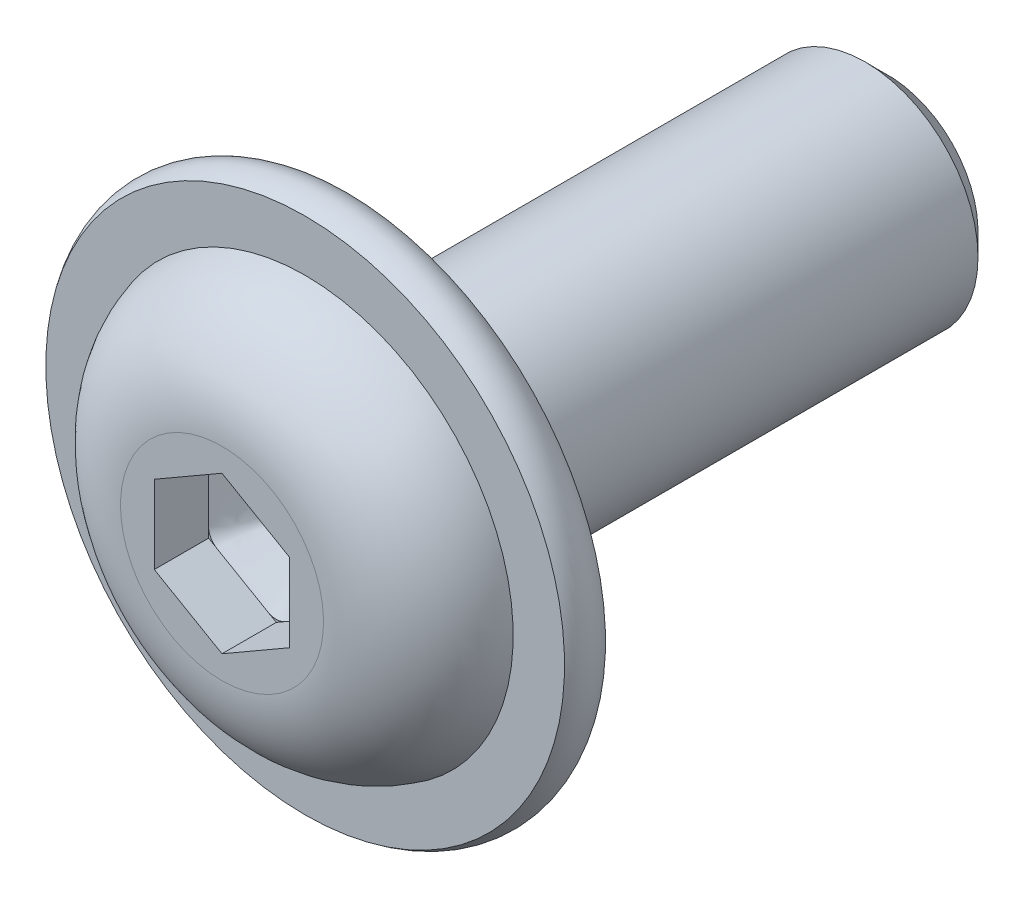
ISO-10303-21;
HEADER;
FILE_DESCRIPTION(('STEP AP214'),'2;1');
FILE_NAME('part.step','',(''),(''),'','','');
FILE_SCHEMA(('AUTOMOTIVE_DESIGN { 1 0 10303 214 1 1 1 1 }'));
ENDSEC;
DATA;
#1=APPLICATION_CONTEXT('core data for automotive mechanical design processes');
#2=APPLICATION_PROTOCOL_DEFINITION('international standard','automotive_design',2000,#1);
#3=PRODUCT_CONTEXT('',#1,'mechanical');
#4=PRODUCT('Part','Part','',(#3));
#5=PRODUCT_RELATED_PRODUCT_CATEGORY('part','',(#4));
#6=PRODUCT_DEFINITION_FORMATION('','',#4);
#7=PRODUCT_DEFINITION_CONTEXT('part definition',#1,'design');
#8=PRODUCT_DEFINITION('design','',#6,#7);
#9=PRODUCT_DEFINITION_SHAPE('','',#8);
#10=(LENGTH_UNIT() NAMED_UNIT(*) SI_UNIT(.MILLI.,.METRE.));
#11=(NAMED_UNIT(*) PLANE_ANGLE_UNIT() SI_UNIT($,.RADIAN.));
#12=(NAMED_UNIT(*) SI_UNIT($,.STERADIAN.) SOLID_ANGLE_UNIT());
#13=UNCERTAINTY_MEASURE_WITH_UNIT(LENGTH_MEASURE(1.E-05),#10,'distance_accuracy_value','');
#14=(GEOMETRIC_REPRESENTATION_CONTEXT(3) GLOBAL_UNCERTAINTY_ASSIGNED_CONTEXT((#13)) GLOBAL_UNIT_ASSIGNED_CONTEXT((#10,
#11,#12)) REPRESENTATION_CONTEXT('',''));
#15=CARTESIAN_POINT('',(0.,0.,0.));
#16=DIRECTION('',(0.,0.,1.));
#17=DIRECTION('',(1.,0.,0.));
#18=AXIS2_PLACEMENT_3D('',#15,#16,#17);
#19=CARTESIAN_POINT('',(0.,0.,6.171875));
#20=DIRECTION('',(0.,0.,1.));
#21=DIRECTION('',(1.,0.,0.));
#22=AXIS2_PLACEMENT_3D('',#19,#20,#21);
#23=PLANE('',#22);
#24=CARTESIAN_POINT('',(-1.125,0.649519052838322,6.171875));
#25=DIRECTION('',(0.,0.,1.));
#26=DIRECTION('',(1.,0.,0.));
#27=AXIS2_PLACEMENT_3D('',#24,#25,#26);
#28=CIRCLE('',#27,0.375);
#29=CARTESIAN_POINT('',(-1.3125,0.974278579257486,6.171875));
#30=VERTEX_POINT('',#29);
#31=CARTESIAN_POINT('',(-1.5,0.649519052850495,6.171875));
#32=VERTEX_POINT('',#31);
#33=EDGE_CURVE('E522',#30,#32,#28,.T.);
#34=ORIENTED_EDGE('',*,*,#33,.F.);
#35=DIRECTION('',(-0.866025403784438,-0.5,0.));
#36=VECTOR('',#35,1.);
#37=CARTESIAN_POINT('',(0.,1.73205080756888,6.171875));
#38=LINE('',#37,#36);
#39=CARTESIAN_POINT('',(-1.5,0.866025403784436,6.171875));
#40=VERTEX_POINT('',#39);
#41=EDGE_CURVE('E375',#30,#40,#38,.T.);
#42=ORIENTED_EDGE('',*,*,#41,.T.);
#43=DIRECTION('',(0.,-1.,0.));
#44=VECTOR('',#43,1.);
#45=CARTESIAN_POINT('',(-1.5,0.866025403784436,6.171875));
#46=LINE('',#45,#44);
#47=EDGE_CURVE('E384',#40,#32,#46,.T.);
#48=ORIENTED_EDGE('',*,*,#47,.T.);
#49=EDGE_LOOP('',(#34,#42,#48));
#50=FACE_BOUND('',#49,.T.);
#51=ADVANCED_FACE('F265',(#50),#23,.T.);
#52=CARTESIAN_POINT('',(-1.125,-0.649519052838331,6.171875));
#53=DIRECTION('',(0.,0.,1.));
#54=DIRECTION('',(-1.,0.,0.));
#55=AXIS2_PLACEMENT_3D('',#52,#53,#54);
#56=CIRCLE('',#55,0.375);
#57=CARTESIAN_POINT('',(-1.5,-0.649519052880153,6.171875));
#58=VERTEX_POINT('',#57);
#59=CARTESIAN_POINT('',(-1.31249999999974,-0.974278579257641,6.171875));
#60=VERTEX_POINT('',#59);
#61=EDGE_CURVE('E513',#58,#60,#56,.T.);
#62=ORIENTED_EDGE('',*,*,#61,.F.);
#63=CARTESIAN_POINT('',(-1.5,-0.866025403784446,6.171875));
#64=VERTEX_POINT('',#63);
#65=EDGE_CURVE('E382',#58,#64,#46,.T.);
#66=ORIENTED_EDGE('',*,*,#65,.T.);
#67=DIRECTION('',(0.866025403784439,-0.5,0.));
#68=VECTOR('',#67,1.);
#69=CARTESIAN_POINT('',(-1.5,-0.866025403784446,6.171875));
#70=LINE('',#69,#68);
#71=EDGE_CURVE('E407',#64,#60,#70,.T.);
#72=ORIENTED_EDGE('',*,*,#71,.T.);
#73=EDGE_LOOP('',(#62,#66,#72));
#74=FACE_BOUND('',#73,.T.);
#75=ADVANCED_FACE('F706',(#74),#23,.T.);
#76=CARTESIAN_POINT('',(0.,-1.29903810567666,6.171875));
#77=DIRECTION('',(0.,0.,1.));
#78=DIRECTION('',(1.,0.,0.));
#79=AXIS2_PLACEMENT_3D('',#76,#77,#78);
#80=CIRCLE('',#79,0.375);
#81=CARTESIAN_POINT('',(-0.187500000016714,-1.62379763208617,6.171875));
#82=VERTEX_POINT('',#81);
#83=CARTESIAN_POINT('',(0.187500000030888,-1.62379763207799,6.171875));
#84=VERTEX_POINT('',#83);
#85=EDGE_CURVE('E587',#82,#84,#80,.T.);
#86=ORIENTED_EDGE('',*,*,#85,.F.);
#87=CARTESIAN_POINT('',(0.,-1.73205080756889,6.171875));
#88=VERTEX_POINT('',#87);
#89=EDGE_CURVE('E404',#82,#88,#70,.T.);
#90=ORIENTED_EDGE('',*,*,#89,.T.);
#91=DIRECTION('',(0.866025403784439,0.5,0.));
#92=VECTOR('',#91,1.);
#93=CARTESIAN_POINT('',(0.,-1.73205080756889,6.171875));
#94=LINE('',#93,#92);
#95=EDGE_CURVE('E417',#88,#84,#94,.T.);
#96=ORIENTED_EDGE('',*,*,#95,.T.);
#97=EDGE_LOOP('',(#86,#90,#96));
#98=FACE_BOUND('',#97,.T.);
#99=ADVANCED_FACE('F710',(#98),#23,.T.);
#100=CARTESIAN_POINT('',(1.125,-0.649519052838332,6.171875));
#101=DIRECTION('',(0.,0.,1.));
#102=DIRECTION('',(1.,0.,0.));
#103=AXIS2_PLACEMENT_3D('',#100,#101,#102);
#104=CIRCLE('',#103,0.375);
#105=CARTESIAN_POINT('',(1.31250000000463,-0.974278579254821,6.171875));
#106=VERTEX_POINT('',#105);
#107=CARTESIAN_POINT('',(1.5,-0.649519052850505,6.171875));
#108=VERTEX_POINT('',#107);
#109=EDGE_CURVE('E552',#106,#108,#104,.T.);
#110=ORIENTED_EDGE('',*,*,#109,.F.);
#111=CARTESIAN_POINT('',(1.5,-0.866025403784445,6.171875));
#112=VERTEX_POINT('',#111);
#113=EDGE_CURVE('E415',#106,#112,#94,.T.);
#114=ORIENTED_EDGE('',*,*,#113,.T.);
#115=DIRECTION('',(0.,1.,0.));
#116=VECTOR('',#115,1.);
#117=CARTESIAN_POINT('',(1.5,-0.866025403784445,6.171875));
#118=LINE('',#117,#116);
#119=EDGE_CURVE('E431',#112,#108,#118,.T.);
#120=ORIENTED_EDGE('',*,*,#119,.T.);
#121=EDGE_LOOP('',(#110,#114,#120));
#122=FACE_BOUND('',#121,.T.);
#123=ADVANCED_FACE('F714',(#122),#23,.T.);
#124=CARTESIAN_POINT('',(1.125,0.649519052838322,6.171875));
#125=DIRECTION('',(0.,0.,1.));
#126=DIRECTION('',(1.,0.,0.));
#127=AXIS2_PLACEMENT_3D('',#124,#125,#126);
#128=CIRCLE('',#127,0.375);
#129=CARTESIAN_POINT('',(1.5,0.649519052880143,6.171875));
#130=VERTEX_POINT('',#129);
#131=CARTESIAN_POINT('',(1.31249999999974,0.974278579257632,6.171875));
#132=VERTEX_POINT('',#131);
#133=EDGE_CURVE('E445',#130,#132,#128,.T.);
#134=ORIENTED_EDGE('',*,*,#133,.F.);
#135=CARTESIAN_POINT('',(1.5,0.866025403784436,6.171875));
#136=VERTEX_POINT('',#135);
#137=EDGE_CURVE('E419',#130,#136,#118,.T.);
#138=ORIENTED_EDGE('',*,*,#137,.T.);
#139=DIRECTION('',(-0.866025403784439,0.5,0.));
#140=VECTOR('',#139,1.);
#141=CARTESIAN_POINT('',(1.5,0.866025403784436,6.171875));
#142=LINE('',#141,#140);
#143=EDGE_CURVE('E436',#136,#132,#142,.T.);
#144=ORIENTED_EDGE('',*,*,#143,.T.);
#145=EDGE_LOOP('',(#134,#138,#144));
#146=FACE_BOUND('',#145,.T.);
#147=ADVANCED_FACE('F443',(#146),#23,.T.);
#148=CARTESIAN_POINT('',(0.,0.,7.375));
#149=DIRECTION('',(0.,0.,-1.));
#150=DIRECTION('',(0.,1.,0.));
#151=AXIS2_PLACEMENT_3D('',#148,#149,#150);
#152=PLANE('',#151);
#153=DIRECTION('',(0.,-1.,0.));
#154=VECTOR('',#153,1.);
#155=CARTESIAN_POINT('',(-1.5,0.866025403784436,7.375));
#156=LINE('',#155,#154);
#157=CARTESIAN_POINT('',(-1.5,0.866025403784436,7.375));
#158=VERTEX_POINT('',#157);
#159=CARTESIAN_POINT('',(-1.5,-0.866025403784446,7.375));
#160=VERTEX_POINT('',#159);
#161=EDGE_CURVE('E625',#158,#160,#156,.T.);
#162=ORIENTED_EDGE('',*,*,#161,.F.);
#163=DIRECTION('',(-0.866025403784438,-0.5,0.));
#164=VECTOR('',#163,1.);
#165=CARTESIAN_POINT('',(0.,1.73205080756888,7.375));
#166=LINE('',#165,#164);
#167=CARTESIAN_POINT('',(0.,1.73205080756888,7.375));
#168=VERTEX_POINT('',#167);
#169=EDGE_CURVE('E291',#168,#158,#166,.T.);
#170=ORIENTED_EDGE('',*,*,#169,.F.);
#171=DIRECTION('',(-0.866025403784439,0.5,0.));
#172=VECTOR('',#171,1.);
#173=CARTESIAN_POINT('',(1.5,0.866025403784436,7.375));
#174=LINE('',#173,#172);
#175=CARTESIAN_POINT('',(1.5,0.866025403784436,7.375));
#176=VERTEX_POINT('',#175);
#177=EDGE_CURVE('E386',#176,#168,#174,.T.);
#178=ORIENTED_EDGE('',*,*,#177,.F.);
#179=DIRECTION('',(0.,1.,0.));
#180=VECTOR('',#179,1.);
#181=CARTESIAN_POINT('',(1.5,-0.866025403784445,7.375));
#182=LINE('',#181,#180);
#183=CARTESIAN_POINT('',(1.5,-0.866025403784445,7.375));
#184=VERTEX_POINT('',#183);
#185=EDGE_CURVE('E453',#184,#176,#182,.T.);
#186=ORIENTED_EDGE('',*,*,#185,.F.);
#187=DIRECTION('',(0.866025403784439,0.5,0.));
#188=VECTOR('',#187,1.);
#189=CARTESIAN_POINT('',(0.,-1.73205080756889,7.375));
#190=LINE('',#189,#188);
#191=CARTESIAN_POINT('',(0.,-1.73205080756889,7.375));
#192=VERTEX_POINT('',#191);
#193=EDGE_CURVE('E632',#192,#184,#190,.T.);
#194=ORIENTED_EDGE('',*,*,#193,.F.);
#195=DIRECTION('',(0.866025403784439,-0.5,0.));
#196=VECTOR('',#195,1.);
#197=CARTESIAN_POINT('',(-1.5,-0.866025403784446,7.375));
#198=LINE('',#197,#196);
#199=EDGE_CURVE('E627',#160,#192,#198,.T.);
#200=ORIENTED_EDGE('',*,*,#199,.F.);
#201=EDGE_LOOP('',(#162,#170,#178,#186,#194,#200));
#202=FACE_BOUND('',#201,.T.);
#203=CARTESIAN_POINT('',(0.,0.,7.375));
#204=DIRECTION('',(0.,0.,1.));
#205=DIRECTION('',(0.,-1.,0.));
#206=AXIS2_PLACEMENT_3D('',#203,#204,#205);
#207=CIRCLE('',#206,2.25);
#208=CARTESIAN_POINT('',(0.,-2.25,7.375));
#209=VERTEX_POINT('',#208);
#210=EDGE_CURVE('E12',#209,#209,#207,.T.);
#211=ORIENTED_EDGE('',*,*,#210,.T.);
#212=EDGE_LOOP('',(#211));
#213=FACE_BOUND('',#212,.T.);
#214=ADVANCED_FACE('F267',(#202,#213),#152,.F.);
#215=CARTESIAN_POINT('',(0.,0.,4.94350347451832));
#216=DIRECTION('',(0.,0.,1.));
#217=DIRECTION('',(0.,-1.,0.));
#218=AXIS2_PLACEMENT_3D('',#215,#216,#217);
#219=DEGENERATE_TOROIDAL_SURFACE('',#218,2.25,2.43149652548168,.T.);
#220=ORIENTED_EDGE('',*,*,#210,.F.);
#221=EDGE_LOOP('',(#220));
#222=FACE_BOUND('',#221,.T.);
#223=CARTESIAN_POINT('',(0.,0.,5.5325));
#224=DIRECTION('',(0.,0.,1.));
#225=DIRECTION('',(0.,-1.,0.));
#226=AXIS2_PLACEMENT_3D('',#223,#224,#225);
#227=CIRCLE('',#226,4.60908);
#228=CARTESIAN_POINT('',(0.,-4.60908000000001,5.5325));
#229=VERTEX_POINT('',#228);
#230=EDGE_CURVE('E275',#229,#229,#227,.T.);
#231=ORIENTED_EDGE('',*,*,#230,.T.);
#232=EDGE_LOOP('',(#231));
#233=FACE_BOUND('',#232,.T.);
#234=ADVANCED_FACE('F665',(#222,#233),#219,.T.);
#235=CARTESIAN_POINT('',(0.,5.7466,5.5325));
#236=DIRECTION('',(0.,0.,-1.));
#237=DIRECTION('',(0.,1.,0.));
#238=AXIS2_PLACEMENT_3D('',#235,#236,#237);
#239=PLANE('',#238);
#240=ORIENTED_EDGE('',*,*,#230,.F.);
#241=EDGE_LOOP('',(#240));
#242=FACE_BOUND('',#241,.T.);
#243=CARTESIAN_POINT('',(0.,0.,5.5325));
#244=DIRECTION('',(0.,0.,1.));
#245=DIRECTION('',(0.,-1.,0.));
#246=AXIS2_PLACEMENT_3D('',#243,#244,#245);
#247=CIRCLE('',#246,5.7466);
#248=CARTESIAN_POINT('',(0.,-5.7466,5.5325));
#249=VERTEX_POINT('',#248);
#250=EDGE_CURVE('E658',#249,#249,#247,.T.);
#251=ORIENTED_EDGE('',*,*,#250,.T.);
#252=EDGE_LOOP('',(#251));
#253=FACE_BOUND('',#252,.T.);
#254=ADVANCED_FACE('F667',(#242,#253),#239,.F.);
#255=CARTESIAN_POINT('',(0.,0.,5.07875));
#256=DIRECTION('',(0.,0.,1.));
#257=DIRECTION('',(0.,-1.,0.));
#258=AXIS2_PLACEMENT_3D('',#255,#256,#257);
#259=TOROIDAL_SURFACE('',#258,5.15221439863103,0.747785601368972);
#260=ORIENTED_EDGE('',*,*,#250,.F.);
#261=EDGE_LOOP('',(#260));
#262=FACE_BOUND('',#261,.T.);
#263=CARTESIAN_POINT('',(0.,0.,4.625));
#264=DIRECTION('',(0.,0.,1.));
#265=DIRECTION('',(0.,-1.,0.));
#266=AXIS2_PLACEMENT_3D('',#263,#264,#265);
#267=CIRCLE('',#266,5.7466);
#268=CARTESIAN_POINT('',(0.,-5.7466,4.625));
#269=VERTEX_POINT('',#268);
#270=EDGE_CURVE('E654',#269,#269,#267,.T.);
#271=ORIENTED_EDGE('',*,*,#270,.T.);
#272=EDGE_LOOP('',(#271));
#273=FACE_BOUND('',#272,.T.);
#274=ADVANCED_FACE('F670',(#262,#273),#259,.T.);
#275=CARTESIAN_POINT('',(0.,2.5,4.625));
#276=DIRECTION('',(0.,0.,1.));
#277=DIRECTION('',(0.,-1.,0.));
#278=AXIS2_PLACEMENT_3D('',#275,#276,#277);
#279=PLANE('',#278);
#280=ORIENTED_EDGE('',*,*,#270,.F.);
#281=EDGE_LOOP('',(#280));
#282=FACE_BOUND('',#281,.T.);
#283=CARTESIAN_POINT('',(0.,0.,4.625));
#284=DIRECTION('',(0.,0.,1.));
#285=DIRECTION('',(0.,-1.,0.));
#286=AXIS2_PLACEMENT_3D('',#283,#284,#285);
#287=CIRCLE('',#286,2.5);
#288=CARTESIAN_POINT('',(0.,-2.5,4.625));
#289=VERTEX_POINT('',#288);
#290=EDGE_CURVE('E650',#289,#289,#287,.T.);
#291=ORIENTED_EDGE('',*,*,#290,.T.);
#292=EDGE_LOOP('',(#291));
#293=FACE_BOUND('',#292,.T.);
#294=ADVANCED_FACE('F676',(#282,#293),#279,.F.);
#295=CARTESIAN_POINT('',(0.,0.,7.375));
#296=DIRECTION('',(0.,0.,1.));
#297=DIRECTION('',(0.,-1.,0.));
#298=AXIS2_PLACEMENT_3D('',#295,#296,#297);
#299=CYLINDRICAL_SURFACE('',#298,2.5);
#300=ORIENTED_EDGE('',*,*,#290,.F.);
#301=EDGE_LOOP('',(#300));
#302=FACE_BOUND('',#301,.T.);
#303=CARTESIAN_POINT('',(0.,0.,-6.875));
#304=DIRECTION('',(0.,0.,1.));
#305=DIRECTION('',(0.,-1.,0.));
#306=AXIS2_PLACEMENT_3D('',#303,#304,#305);
#307=CIRCLE('',#306,2.5);
#308=CARTESIAN_POINT('',(0.,-2.5,-6.875));
#309=VERTEX_POINT('',#308);
#310=EDGE_CURVE('E646',#309,#309,#307,.T.);
#311=ORIENTED_EDGE('',*,*,#310,.T.);
#312=EDGE_LOOP('',(#311));
#313=FACE_BOUND('',#312,.T.);
#314=ADVANCED_FACE('F682',(#302,#313),#299,.T.);
#315=CARTESIAN_POINT('',(0.,0.,-7.375));
#316=DIRECTION('',(0.,0.,1.));
#317=DIRECTION('',(0.,-1.,0.));
#318=AXIS2_PLACEMENT_3D('',#315,#316,#317);
#319=CONICAL_SURFACE('',#318,2.00000000000001,0.785398163397441);
#320=ORIENTED_EDGE('',*,*,#310,.F.);
#321=EDGE_LOOP('',(#320));
#322=FACE_BOUND('',#321,.T.);
#323=CARTESIAN_POINT('',(0.,0.,-7.375));
#324=DIRECTION('',(0.,0.,1.));
#325=DIRECTION('',(0.,-1.,0.));
#326=AXIS2_PLACEMENT_3D('',#323,#324,#325);
#327=CIRCLE('',#326,2.00000000000001);
#328=CARTESIAN_POINT('',(0.,-2.00000000000001,-7.375));
#329=VERTEX_POINT('',#328);
#330=EDGE_CURVE('E637',#329,#329,#327,.T.);
#331=ORIENTED_EDGE('',*,*,#330,.T.);
#332=EDGE_LOOP('',(#331));
#333=FACE_BOUND('',#332,.T.);
#334=ADVANCED_FACE('F688',(#322,#333),#319,.T.);
#335=CARTESIAN_POINT('',(0.,2.00000000000001,-7.375));
#336=DIRECTION('',(0.,0.,1.));
#337=DIRECTION('',(0.,-1.,0.));
#338=AXIS2_PLACEMENT_3D('',#335,#336,#337);
#339=PLANE('',#338);
#340=ORIENTED_EDGE('',*,*,#330,.F.);
#341=EDGE_LOOP('',(#340));
#342=FACE_BOUND('',#341,.T.);
#343=ADVANCED_FACE('F694',(#342),#339,.F.);
#344=CARTESIAN_POINT('',(0.,1.73205080756888,6.171875));
#345=DIRECTION('',(-0.5,0.866025403784438,0.));
#346=DIRECTION('',(-0.866025403784439,-0.5,0.));
#347=AXIS2_PLACEMENT_3D('',#344,#345,#346);
#348=PLANE('',#347);
#349=ORIENTED_EDGE('',*,*,#169,.T.);
#350=DIRECTION('',(0.,0.,1.));
#351=VECTOR('',#350,1.);
#352=CARTESIAN_POINT('',(-1.5,0.866025403784436,6.171875));
#353=LINE('',#352,#351);
#354=EDGE_CURVE('E462',#40,#158,#353,.T.);
#355=ORIENTED_EDGE('',*,*,#354,.F.);
#356=ORIENTED_EDGE('',*,*,#41,.F.);
#357=DIRECTION('',(-0.866025403784438,-0.5,0.));
#358=VECTOR('',#357,1.);
#359=CARTESIAN_POINT('',(-0.1875,1.62379763209581,6.171875));
#360=LINE('',#359,#358);
#361=CARTESIAN_POINT('',(-0.1875,1.62379763209581,6.171875));
#362=VERTEX_POINT('',#361);
#363=EDGE_CURVE('E360',#362,#30,#360,.T.);
#364=ORIENTED_EDGE('',*,*,#363,.F.);
#365=CARTESIAN_POINT('',(0.,1.73205080756888,6.171875));
#366=VERTEX_POINT('',#365);
#367=EDGE_CURVE('E374',#366,#362,#38,.T.);
#368=ORIENTED_EDGE('',*,*,#367,.F.);
#369=DIRECTION('',(0.,0.,1.));
#370=VECTOR('',#369,1.);
#371=CARTESIAN_POINT('',(0.,1.73205080756888,6.171875));
#372=LINE('',#371,#370);
#373=EDGE_CURVE('E457',#366,#168,#372,.T.);
#374=ORIENTED_EDGE('',*,*,#373,.T.);
#375=EDGE_LOOP('',(#349,#355,#356,#364,#368,#374));
#376=FACE_BOUND('',#375,.T.);
#377=ADVANCED_FACE('F373',(#376),#348,.F.);
#378=CARTESIAN_POINT('',(1.5,0.866025403784436,6.171875));
#379=DIRECTION('',(0.5,0.866025403784439,0.));
#380=DIRECTION('',(-0.866025403784439,0.5,0.));
#381=AXIS2_PLACEMENT_3D('',#378,#379,#380);
#382=PLANE('',#381);
#383=ORIENTED_EDGE('',*,*,#177,.T.);
#384=ORIENTED_EDGE('',*,*,#373,.F.);
#385=CARTESIAN_POINT('',(0.187500000000004,1.62379763209582,6.171875));
#386=VERTEX_POINT('',#385);
#387=EDGE_CURVE('E380',#386,#366,#142,.T.);
#388=ORIENTED_EDGE('',*,*,#387,.F.);
#389=DIRECTION('',(-0.866025403784438,0.5,0.));
#390=VECTOR('',#389,1.);
#391=CARTESIAN_POINT('',(1.3125,0.974278579257487,6.171875));
#392=LINE('',#391,#390);
#393=EDGE_CURVE('E269',#132,#386,#392,.T.);
#394=ORIENTED_EDGE('',*,*,#393,.F.);
#395=ORIENTED_EDGE('',*,*,#143,.F.);
#396=DIRECTION('',(0.,0.,1.));
#397=VECTOR('',#396,1.);
#398=CARTESIAN_POINT('',(1.5,0.866025403784436,6.171875));
#399=LINE('',#398,#397);
#400=EDGE_CURVE('E450',#136,#176,#399,.T.);
#401=ORIENTED_EDGE('',*,*,#400,.T.);
#402=EDGE_LOOP('',(#383,#384,#388,#394,#395,#401));
#403=FACE_BOUND('',#402,.T.);
#404=ADVANCED_FACE('F460',(#403),#382,.F.);
#405=CARTESIAN_POINT('',(1.5,-0.866025403784445,6.171875));
#406=DIRECTION('',(1.,0.,0.));
#407=DIRECTION('',(0.,1.,0.));
#408=AXIS2_PLACEMENT_3D('',#405,#406,#407);
#409=PLANE('',#408);
#410=ORIENTED_EDGE('',*,*,#185,.T.);
#411=ORIENTED_EDGE('',*,*,#400,.F.);
#412=ORIENTED_EDGE('',*,*,#137,.F.);
#413=DIRECTION('',(0.,1.,0.));
#414=VECTOR('',#413,1.);
#415=CARTESIAN_POINT('',(1.5,-0.649519052838332,6.171875));
#416=LINE('',#415,#414);
#417=EDGE_CURVE('E543',#108,#130,#416,.T.);
#418=ORIENTED_EDGE('',*,*,#417,.F.);
#419=ORIENTED_EDGE('',*,*,#119,.F.);
#420=DIRECTION('',(0.,0.,1.));
#421=VECTOR('',#420,1.);
#422=CARTESIAN_POINT('',(1.5,-0.866025403784445,6.171875));
#423=LINE('',#422,#421);
#424=EDGE_CURVE('E458',#112,#184,#423,.T.);
#425=ORIENTED_EDGE('',*,*,#424,.T.);
#426=EDGE_LOOP('',(#410,#411,#412,#418,#419,#425));
#427=FACE_BOUND('',#426,.T.);
#428=ADVANCED_FACE('F451',(#427),#409,.F.);
#429=CARTESIAN_POINT('',(0.,-1.73205080756889,6.171875));
#430=DIRECTION('',(0.5,-0.866025403784439,0.));
#431=DIRECTION('',(0.866025403784439,0.5,0.));
#432=AXIS2_PLACEMENT_3D('',#429,#430,#431);
#433=PLANE('',#432);
#434=ORIENTED_EDGE('',*,*,#193,.T.);
#435=ORIENTED_EDGE('',*,*,#424,.F.);
#436=ORIENTED_EDGE('',*,*,#113,.F.);
#437=DIRECTION('',(0.866025403784439,0.5,0.));
#438=VECTOR('',#437,1.);
#439=CARTESIAN_POINT('',(0.1875,-1.62379763209582,6.171875));
#440=LINE('',#439,#438);
#441=EDGE_CURVE('E580',#84,#106,#440,.T.);
#442=ORIENTED_EDGE('',*,*,#441,.F.);
#443=ORIENTED_EDGE('',*,*,#95,.F.);
#444=DIRECTION('',(0.,0.,1.));
#445=VECTOR('',#444,1.);
#446=CARTESIAN_POINT('',(0.,-1.73205080756889,6.171875));
#447=LINE('',#446,#445);
#448=EDGE_CURVE('E640',#88,#192,#447,.T.);
#449=ORIENTED_EDGE('',*,*,#448,.T.);
#450=EDGE_LOOP('',(#434,#435,#436,#442,#443,#449));
#451=FACE_BOUND('',#450,.T.);
#452=ADVANCED_FACE('F565',(#451),#433,.F.);
#453=CARTESIAN_POINT('',(-1.5,-0.866025403784446,6.171875));
#454=DIRECTION('',(-0.5,-0.866025403784439,0.));
#455=DIRECTION('',(0.866025403784439,-0.5,0.));
#456=AXIS2_PLACEMENT_3D('',#453,#454,#455);
#457=PLANE('',#456);
#458=ORIENTED_EDGE('',*,*,#199,.T.);
#459=ORIENTED_EDGE('',*,*,#448,.F.);
#460=ORIENTED_EDGE('',*,*,#89,.F.);
#461=DIRECTION('',(0.866025403784438,-0.5,0.));
#462=VECTOR('',#461,1.);
#463=CARTESIAN_POINT('',(-1.3125,-0.974278579257496,6.171875));
#464=LINE('',#463,#462);
#465=EDGE_CURVE('E596',#60,#82,#464,.T.);
#466=ORIENTED_EDGE('',*,*,#465,.F.);
#467=ORIENTED_EDGE('',*,*,#71,.F.);
#468=DIRECTION('',(0.,0.,1.));
#469=VECTOR('',#468,1.);
#470=CARTESIAN_POINT('',(-1.5,-0.866025403784446,6.171875));
#471=LINE('',#470,#469);
#472=EDGE_CURVE('E463',#64,#160,#471,.T.);
#473=ORIENTED_EDGE('',*,*,#472,.T.);
#474=EDGE_LOOP('',(#458,#459,#460,#466,#467,#473));
#475=FACE_BOUND('',#474,.T.);
#476=ADVANCED_FACE('F569',(#475),#457,.F.);
#477=CARTESIAN_POINT('',(-1.5,0.866025403784436,6.171875));
#478=DIRECTION('',(-1.,0.,0.));
#479=DIRECTION('',(0.,-1.,0.));
#480=AXIS2_PLACEMENT_3D('',#477,#478,#479);
#481=PLANE('',#480);
#482=ORIENTED_EDGE('',*,*,#161,.T.);
#483=ORIENTED_EDGE('',*,*,#472,.F.);
#484=ORIENTED_EDGE('',*,*,#65,.F.);
#485=DIRECTION('',(0.,-1.,0.));
#486=VECTOR('',#485,1.);
#487=CARTESIAN_POINT('',(-1.5,0.649519052838322,6.171875));
#488=LINE('',#487,#486);
#489=EDGE_CURVE('E525',#32,#58,#488,.T.);
#490=ORIENTED_EDGE('',*,*,#489,.F.);
#491=ORIENTED_EDGE('',*,*,#47,.F.);
#492=ORIENTED_EDGE('',*,*,#354,.T.);
#493=EDGE_LOOP('',(#482,#483,#484,#490,#491,#492));
#494=FACE_BOUND('',#493,.T.);
#495=ADVANCED_FACE('F480',(#494),#481,.F.);
#496=CARTESIAN_POINT('',(0.,1.29903810567665,6.171875));
#497=DIRECTION('',(0.,0.,1.));
#498=DIRECTION('',(1.,0.,0.));
#499=AXIS2_PLACEMENT_3D('',#496,#497,#498);
#500=CIRCLE('',#499,0.375);
#501=EDGE_CURVE('E355',#386,#362,#500,.T.);
#502=ORIENTED_EDGE('',*,*,#501,.F.);
#503=ORIENTED_EDGE('',*,*,#387,.T.);
#504=ORIENTED_EDGE('',*,*,#367,.T.);
#505=EDGE_LOOP('',(#502,#503,#504));
#506=FACE_BOUND('',#505,.T.);
#507=ADVANCED_FACE('F379',(#506),#23,.T.);
#508=CARTESIAN_POINT('',(0.,0.,5.07875));
#509=DIRECTION('',(0.,0.,1.));
#510=DIRECTION('',(1.,0.,0.));
#511=AXIS2_PLACEMENT_3D('',#508,#509,#510);
#512=PLANE('',#511);
#513=CARTESIAN_POINT('',(0.,0.,5.07875));
#514=DIRECTION('',(0.,0.,1.));
#515=DIRECTION('',(1.,0.,0.));
#516=AXIS2_PLACEMENT_3D('',#513,#514,#515);
#517=CIRCLE('',#516,0.105);
#518=CARTESIAN_POINT('',(0.105,0.,5.07875));
#519=VERTEX_POINT('',#518);
#520=EDGE_CURVE('E376',#519,#519,#517,.T.);
#521=ORIENTED_EDGE('',*,*,#520,.T.);
#522=EDGE_LOOP('',(#521));
#523=FACE_BOUND('',#522,.T.);
#524=ADVANCED_FACE('F479',(#523),#512,.T.);
#525=CARTESIAN_POINT('',(0.187500000164199,1.62379763200101,6.171875));
#526=CARTESIAN_POINT('',(0.0120443260179902,0.104306923120049,5.07875));
#527=CARTESIAN_POINT('',(0.282017249555657,1.56922807262179,6.171875));
#528=CARTESIAN_POINT('',(0.0190910830471577,0.103493233706508,5.07875));
#529=CARTESIAN_POINT('',(0.469887053600956,1.46076139068364,6.17187499999999));
#530=CARTESIAN_POINT('',(0.0331048643470912,0.10042072212686,5.07875));
#531=CARTESIAN_POINT('',(0.749999999999997,1.29903810567665,6.17187500000001));
#532=CARTESIAN_POINT('',(0.0528704552464663,0.0915743147061731,5.07875));
#533=CARTESIAN_POINT('',(1.03011294639904,1.13731482066966,6.17187499999999));
#534=CARTESIAN_POINT('',(0.070414464254696,0.0788800145768472,5.07875));
#535=CARTESIAN_POINT('',(1.21798275044434,1.02884813873151,6.171875));
#536=CARTESIAN_POINT('',(0.0800822279860596,0.0682799797578494,5.07875));
#537=CARTESIAN_POINT('',(1.3400733652984,0.958359089379989,6.171875));
#538=CARTESIAN_POINT('',(0.0855437256743068,0.0609225197167106,5.07875));
#539=CARTESIAN_POINT('',(1.39225725310068,0.918772224874287,6.17187499999999));
#540=CARTESIAN_POINT('',(0.0878594345009751,0.0575991706222851,5.07875000000001));
#541=CARTESIAN_POINT('',(1.45363694042499,0.839243943387675,6.17187500000001));
#542=CARTESIAN_POINT('',(0.0909811087636806,0.0525279676358785,5.07874999999999));
#543=CARTESIAN_POINT('',(1.49180477751983,0.746350940129396,6.171875));
#544=CARTESIAN_POINT('',(0.0938120622463033,0.0472889169288325,5.07875000000001));
#545=CARTESIAN_POINT('',(1.5,0.681358032593316,6.171875));
#546=CARTESIAN_POINT('',(0.0955323125743857,0.043621779709957,5.07875));
#547=CARTESIAN_POINT('',(1.5,0.540379933890279,6.171875));
#548=CARTESIAN_POINT('',(0.0991733110332172,0.0352132539486556,5.07875));
#549=CARTESIAN_POINT('',(1.5,0.323446570013969,6.171875));
#550=CARTESIAN_POINT('',(0.103519328601787,0.0215407075500099,5.07875));
#551=CARTESIAN_POINT('',(1.5,0.,6.171875));
#552=CARTESIAN_POINT('',(0.105740910492932,0.,5.07875));
#553=CARTESIAN_POINT('',(1.5,-0.323446570013979,6.171875));
#554=CARTESIAN_POINT('',(0.103519328601787,-0.0215407075500159,5.07875));
#555=CARTESIAN_POINT('',(1.5,-0.540379933890289,6.171875));
#556=CARTESIAN_POINT('',(0.0991733110332172,-0.0352132539486615,5.07875));
#557=CARTESIAN_POINT('',(1.5,-0.681358032593326,6.171875));
#558=CARTESIAN_POINT('',(0.0955323125743857,-0.043621779709963,5.07875));
#559=CARTESIAN_POINT('',(1.49180871358303,-0.746344037351187,6.17187499999999));
#560=CARTESIAN_POINT('',(0.0938120622463032,-0.0472889169288384,5.07875));
#561=CARTESIAN_POINT('',(1.45362504515845,-0.83926454659369,6.17187500000001));
#562=CARTESIAN_POINT('',(0.0909811087636806,-0.0525279676358847,5.07875000000001));
#563=CARTESIAN_POINT('',(1.39226126305037,-0.918765364754469,6.17187499999999));
#564=CARTESIAN_POINT('',(0.0878594345009751,-0.057599170622291,5.07875));
#565=CARTESIAN_POINT('',(1.3400733652984,-0.958359089379999,6.171875));
#566=CARTESIAN_POINT('',(0.0855437256743067,-0.0609225197167167,5.07875));
#567=CARTESIAN_POINT('',(1.21798275044434,-1.02884813873152,6.171875));
#568=CARTESIAN_POINT('',(0.0800822279860595,-0.0682799797578554,5.07875));
#569=CARTESIAN_POINT('',(1.03011294639904,-1.13731482066967,6.171875));
#570=CARTESIAN_POINT('',(0.0704144642546959,-0.0788800145768532,5.07875));
#571=CARTESIAN_POINT('',(0.749999999999999,-1.29903810567666,6.17187500000001));
#572=CARTESIAN_POINT('',(0.0528704552464662,-0.0915743147061791,5.07875));
#573=CARTESIAN_POINT('',(0.469887053600953,-1.46076139068365,6.17187499999999));
#574=CARTESIAN_POINT('',(0.033104864347091,-0.100420722126866,5.07875));
#575=CARTESIAN_POINT('',(0.282017249555657,-1.5692280726218,6.171875));
#576=CARTESIAN_POINT('',(0.0190910830471576,-0.103493233706514,5.07875));
#577=CARTESIAN_POINT('',(0.159926634701596,-1.63971712197332,6.171875));
#578=CARTESIAN_POINT('',(0.00998858690007891,-0.104544299426677,5.07875));
#579=CARTESIAN_POINT('',(0.0995514604823481,-1.66511626222548,6.171875));
#580=CARTESIAN_POINT('',(0.00595262774532817,-0.104888087551126,5.07875));
#581=CARTESIAN_POINT('',(-1.18952665347584E-05,-1.67850848998137,6.17187500000001));
#582=CARTESIAN_POINT('',(0.,-0.105055935271766,5.07875));
#583=CARTESIAN_POINT('',(-0.0995435144694533,-1.66511630488387,6.17187499999999));
#584=CARTESIAN_POINT('',(-0.00595262774532821,-0.104888087551127,5.07875000000001));
#585=CARTESIAN_POINT('',(-0.159926634701596,-1.63971712197332,6.171875));
#586=CARTESIAN_POINT('',(-0.00998858690007895,-0.104544299426677,5.07875));
#587=CARTESIAN_POINT('',(-0.282017249555657,-1.5692280726218,6.171875));
#588=CARTESIAN_POINT('',(-0.0190910830471576,-0.103493233706514,5.07875));
#589=CARTESIAN_POINT('',(-0.469887053600954,-1.46076139068365,6.171875));
#590=CARTESIAN_POINT('',(-0.033104864347091,-0.100420722126866,5.07875));
#591=CARTESIAN_POINT('',(-0.749999999999998,-1.29903810567666,6.171875));
#592=CARTESIAN_POINT('',(-0.0528704552464664,-0.091574314706179,5.07875000000001));
#593=CARTESIAN_POINT('',(-1.03011294639904,-1.13731482066967,6.171875));
#594=CARTESIAN_POINT('',(-0.0704144642546959,-0.0788800145768532,5.07875));
#595=CARTESIAN_POINT('',(-1.21798275044434,-1.02884813873152,6.171875));
#596=CARTESIAN_POINT('',(-0.0800822279860596,-0.0682799797578554,5.07875));
#597=CARTESIAN_POINT('',(-1.3400733652984,-0.958359089379998,6.171875));
#598=CARTESIAN_POINT('',(-0.0855437256743068,-0.0609225197167166,5.07875));
#599=CARTESIAN_POINT('',(-1.39225725310068,-0.918772224874297,6.171875));
#600=CARTESIAN_POINT('',(-0.0878594345009752,-0.057599170622291,5.07875));
#601=CARTESIAN_POINT('',(-1.45363694042499,-0.839243943387684,6.171875));
#602=CARTESIAN_POINT('',(-0.0909811087636805,-0.0525279676358845,5.07875));
#603=CARTESIAN_POINT('',(-1.49180477751983,-0.746350940129406,6.171875));
#604=CARTESIAN_POINT('',(-0.0938120622463034,-0.0472889169288384,5.07875));
#605=CARTESIAN_POINT('',(-1.5,-0.681358032593326,6.171875));
#606=CARTESIAN_POINT('',(-0.0955323125743857,-0.0436217797099629,5.07875));
#607=CARTESIAN_POINT('',(-1.5,-0.540379933890289,6.171875));
#608=CARTESIAN_POINT('',(-0.0991733110332172,-0.0352132539486615,5.07875));
#609=CARTESIAN_POINT('',(-1.5,-0.323446570013979,6.171875));
#610=CARTESIAN_POINT('',(-0.103519328601787,-0.0215407075500159,5.07875));
#611=CARTESIAN_POINT('',(-1.5,0.,6.171875));
#612=CARTESIAN_POINT('',(-0.105740910492933,0.,5.07875));
#613=CARTESIAN_POINT('',(-1.5,0.32344657001397,6.171875));
#614=CARTESIAN_POINT('',(-0.103519328601787,0.0215407075500099,5.07875));
#615=CARTESIAN_POINT('',(-1.5,0.54037993389028,6.171875));
#616=CARTESIAN_POINT('',(-0.0991733110332172,0.0352132539486555,5.07875));
#617=CARTESIAN_POINT('',(-1.5,0.681358032593316,6.171875));
#618=CARTESIAN_POINT('',(-0.0955323125743857,0.043621779709957,5.07875));
#619=CARTESIAN_POINT('',(-1.49180871358302,0.746344037351176,6.17187499999999));
#620=CARTESIAN_POINT('',(-0.0938120622463032,0.0472889169288324,5.07875));
#621=CARTESIAN_POINT('',(-1.45362504515846,0.839264546593682,6.17187500000001));
#622=CARTESIAN_POINT('',(-0.0909811087636807,0.0525279676358786,5.07875000000001));
#623=CARTESIAN_POINT('',(-1.39226126305037,0.918765364754457,6.17187499999999));
#624=CARTESIAN_POINT('',(-0.087859434500975,0.057599170622285,5.07875));
#625=CARTESIAN_POINT('',(-1.3400733652984,0.958359089379989,6.171875));
#626=CARTESIAN_POINT('',(-0.0855437256743068,0.0609225197167106,5.07875));
#627=CARTESIAN_POINT('',(-1.21798275044434,1.02884813873151,6.171875));
#628=CARTESIAN_POINT('',(-0.0800822279860596,0.0682799797578494,5.07875));
#629=CARTESIAN_POINT('',(-1.03011294639904,1.13731482066966,6.171875));
#630=CARTESIAN_POINT('',(-0.070414464254696,0.0788800145768472,5.07875));
#631=CARTESIAN_POINT('',(-0.749999999999999,1.29903810567665,6.171875));
#632=CARTESIAN_POINT('',(-0.0528704552464662,0.0915743147061731,5.07875));
#633=CARTESIAN_POINT('',(-0.469887053600954,1.46076139068363,6.171875));
#634=CARTESIAN_POINT('',(-0.0331048643470911,0.10042072212686,5.07875));
#635=CARTESIAN_POINT('',(-0.282017249555656,1.56922807262179,6.171875));
#636=CARTESIAN_POINT('',(-0.0190910830471576,0.103493233706508,5.07875));
#637=CARTESIAN_POINT('',(-0.159926634701596,1.63971712197331,6.171875));
#638=CARTESIAN_POINT('',(-0.0099885869000789,0.104544299426671,5.07875));
#639=CARTESIAN_POINT('',(-0.0995514604823476,1.66511626222547,6.171875));
#640=CARTESIAN_POINT('',(-0.00595262774532808,0.10488808755112,5.07875));
#641=CARTESIAN_POINT('',(1.18952665358833E-05,1.67850848998136,6.171875));
#642=CARTESIAN_POINT('',(0.,0.10505593527176,5.07875));
#643=CARTESIAN_POINT('',(0.0995435144694535,1.66511630488386,6.171875));
#644=CARTESIAN_POINT('',(0.00595262774532832,0.10488808755112,5.07875));
#645=CARTESIAN_POINT('',(0.159926634701597,1.63971712197331,6.171875));
#646=CARTESIAN_POINT('',(0.00998858690007901,0.104544299426671,5.07875));
#647=CARTESIAN_POINT('',(0.187500000164199,1.62379763200101,6.171875));
#648=CARTESIAN_POINT('',(0.0120443260179902,0.104306923120049,5.07875));
#649=B_SPLINE_SURFACE_WITH_KNOTS('',3,1,((#525,#526),(#527,#528),(#529,#530),(#531,#532),(#533,
#534),(#535,#536),(#537,#538),(#539,#540),(#541,#542),(#543,#544),(#545,#546),(#547,#548),(#549,
#550),(#551,#552),(#553,#554),(#555,#556),(#557,#558),(#559,#560),(#561,#562),(#563,#564),(#565,
#566),(#567,#568),(#569,#570),(#571,#572),(#573,#574),(#575,#576),(#577,#578),(#579,#580),(#581,
#582),(#583,#584),(#585,#586),(#587,#588),(#589,#590),(#591,#592),(#593,#594),(#595,#596),(#597,
#598),(#599,#600),(#601,#602),(#603,#604),(#605,#606),(#607,#608),(#609,#610),(#611,#612),(#613,
#614),(#615,#616),(#617,#618),(#619,#620),(#621,#622),(#623,#624),(#625,#626),(#627,#628),(#629,
#630),(#631,#632),(#633,#634),(#635,#636),(#637,#638),(#639,#640),(#641,#642),(#643,#644),(#645,
#646),(#647,#648)),.UNSPECIFIED.,.T.,.F.,.F.,(4,1,1,1,2,1,1,1,2,1,1,1,2,1,1,1,2,1,1,1,2,1,1,1,2,
1,1,1,2,1,1,1,2,1,1,1,2,1,1,1,2,1,1,1,2,1,1,1,4),(2,2),(0.,0.0322565229878777,
0.0645130459757554,0.0967695689636331,0.129026091951511,0.1384362356303,0.147846379309089,
0.157256522987878,0.166666666666667,0.198923189654544,0.231179712642422,0.2634362356303,
0.295692758618178,0.305102902296967,0.314513045975755,0.323923189654544,0.333333333333333,
0.365589856321211,0.397846379309089,0.430102902296966,0.462359425284844,0.471769568963633,
0.481179712642422,0.490589856321211,0.5,0.532256522987878,0.564513045975755,0.596769568963633,
0.629026091951511,0.6384362356303,0.647846379309089,0.657256522987878,0.666666666666667,
0.698923189654544,0.731179712642422,0.7634362356303,0.795692758618177,0.805102902296966,
0.814513045975755,0.823923189654544,0.833333333333333,0.865589856321211,0.897846379309089,
0.930102902296966,0.962359425284844,0.971769568963633,0.981179712642422,0.990589856321211,1.),
(0.,1.),.UNSPECIFIED.);
#650=ORIENTED_EDGE('',*,*,#501,.T.);
#651=ORIENTED_EDGE('',*,*,#363,.T.);
#652=ORIENTED_EDGE('',*,*,#33,.T.);
#653=ORIENTED_EDGE('',*,*,#489,.T.);
#654=ORIENTED_EDGE('',*,*,#61,.T.);
#655=ORIENTED_EDGE('',*,*,#465,.T.);
#656=ORIENTED_EDGE('',*,*,#85,.T.);
#657=ORIENTED_EDGE('',*,*,#441,.T.);
#658=ORIENTED_EDGE('',*,*,#109,.T.);
#659=ORIENTED_EDGE('',*,*,#417,.T.);
#660=ORIENTED_EDGE('',*,*,#133,.T.);
#661=ORIENTED_EDGE('',*,*,#393,.T.);
#662=EDGE_LOOP('',(#650,#651,#652,#653,#654,#655,#656,#657,#658,#659,#660,#661));
#663=FACE_BOUND('',#662,.T.);
#664=ORIENTED_EDGE('',*,*,#520,.F.);
#665=EDGE_LOOP('',(#664));
#666=FACE_BOUND('',#665,.T.);
#667=ADVANCED_FACE('F358',(#663,#666),#649,.F.);
#668=CLOSED_SHELL('',(#51,#75,#99,#123,#147,#214,#234,#254,#274,#294,#314,#334,#343,#377,#404,
#428,#452,#476,#495,#507,#524,#667));
#669=MANIFOLD_SOLID_BREP('B2',#668);
#670=ADVANCED_BREP_SHAPE_REPRESENTATION('',(#18,#669),#14);
#671=SHAPE_DEFINITION_REPRESENTATION(#9,#670);
ENDSEC;
END-ISO-10303-21;
